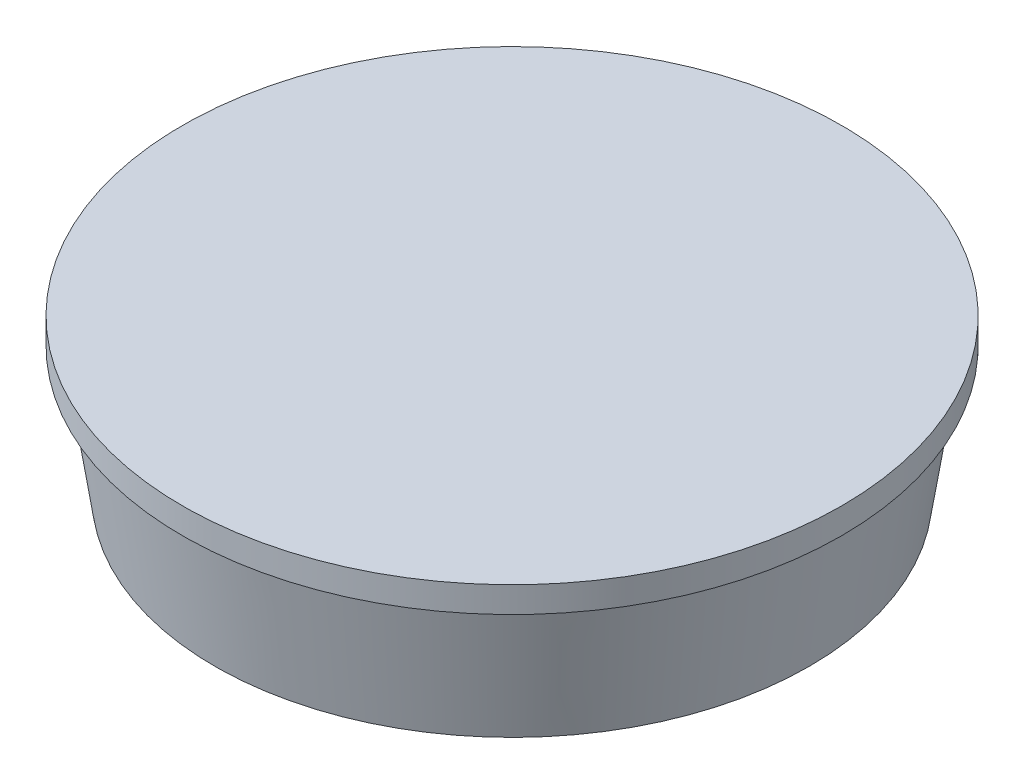
ISO-10303-21;
HEADER;
FILE_DESCRIPTION(('STEP AP214'),'2;1');
FILE_NAME('part.step','',(''),(''),'','','');
FILE_SCHEMA(('AUTOMOTIVE_DESIGN { 1 0 10303 214 1 1 1 1 }'));
ENDSEC;
DATA;
#1=APPLICATION_CONTEXT('core data for automotive mechanical design processes');
#2=APPLICATION_PROTOCOL_DEFINITION('international standard','automotive_design',2000,#1);
#3=PRODUCT_CONTEXT('',#1,'mechanical');
#4=PRODUCT('Part','Part','',(#3));
#5=PRODUCT_RELATED_PRODUCT_CATEGORY('part','',(#4));
#6=PRODUCT_DEFINITION_FORMATION('','',#4);
#7=PRODUCT_DEFINITION_CONTEXT('part definition',#1,'design');
#8=PRODUCT_DEFINITION('design','',#6,#7);
#9=PRODUCT_DEFINITION_SHAPE('','',#8);
#10=(LENGTH_UNIT() NAMED_UNIT(*) SI_UNIT(.MILLI.,.METRE.));
#11=(NAMED_UNIT(*) PLANE_ANGLE_UNIT() SI_UNIT($,.RADIAN.));
#12=(NAMED_UNIT(*) SI_UNIT($,.STERADIAN.) SOLID_ANGLE_UNIT());
#13=UNCERTAINTY_MEASURE_WITH_UNIT(LENGTH_MEASURE(1.E-05),#10,'distance_accuracy_value','');
#14=(GEOMETRIC_REPRESENTATION_CONTEXT(3) GLOBAL_UNCERTAINTY_ASSIGNED_CONTEXT((#13)) GLOBAL_UNIT_ASSIGNED_CONTEXT((#10,
#11,#12)) REPRESENTATION_CONTEXT('',''));
#15=CARTESIAN_POINT('',(0.,0.,0.));
#16=DIRECTION('',(0.,0.,1.));
#17=DIRECTION('',(1.,0.,0.));
#18=AXIS2_PLACEMENT_3D('',#15,#16,#17);
#19=CARTESIAN_POINT('',(0.,0.,0.));
#20=DIRECTION('',(0.,1.,0.));
#21=DIRECTION('',(-1.,0.,0.));
#22=AXIS2_PLACEMENT_3D('',#19,#20,#21);
#23=PLANE('',#22);
#24=CARTESIAN_POINT('',(0.,0.,0.));
#25=DIRECTION('',(0.,-1.,0.));
#26=DIRECTION('',(1.,0.,0.));
#27=AXIS2_PLACEMENT_3D('',#24,#25,#26);
#28=CIRCLE('',#27,25.5);
#29=CARTESIAN_POINT('',(25.5,0.,0.));
#30=VERTEX_POINT('',#29);
#31=EDGE_CURVE('E42',#30,#30,#28,.T.);
#32=ORIENTED_EDGE('',*,*,#31,.F.);
#33=EDGE_LOOP('',(#32));
#34=FACE_BOUND('',#33,.T.);
#35=ADVANCED_FACE('F31',(#34),#23,.T.);
#36=CARTESIAN_POINT('',(0.,-2.,0.));
#37=DIRECTION('',(0.,-1.,0.));
#38=DIRECTION('',(1.,0.,0.));
#39=AXIS2_PLACEMENT_3D('',#36,#37,#38);
#40=CYLINDRICAL_SURFACE('',#39,25.5);
#41=ORIENTED_EDGE('',*,*,#31,.T.);
#42=EDGE_LOOP('',(#41));
#43=FACE_BOUND('',#42,.T.);
#44=CARTESIAN_POINT('',(0.,-1.99999999999999,0.));
#45=DIRECTION('',(0.,-1.,0.));
#46=DIRECTION('',(1.,0.,0.));
#47=AXIS2_PLACEMENT_3D('',#44,#45,#46);
#48=CIRCLE('',#47,25.5);
#49=CARTESIAN_POINT('',(25.5,-2.,0.));
#50=VERTEX_POINT('',#49);
#51=EDGE_CURVE('E46',#50,#50,#48,.T.);
#52=ORIENTED_EDGE('',*,*,#51,.F.);
#53=EDGE_LOOP('',(#52));
#54=FACE_BOUND('',#53,.T.);
#55=ADVANCED_FACE('F78',(#43,#54),#40,.T.);
#56=CARTESIAN_POINT('',(25.5,-2.,0.));
#57=DIRECTION('',(0.,-1.,0.));
#58=DIRECTION('',(1.,0.,0.));
#59=AXIS2_PLACEMENT_3D('',#56,#57,#58);
#60=PLANE('',#59);
#61=ORIENTED_EDGE('',*,*,#51,.T.);
#62=EDGE_LOOP('',(#61));
#63=FACE_BOUND('',#62,.T.);
#64=CARTESIAN_POINT('',(0.,-1.99999999999999,0.));
#65=DIRECTION('',(0.,-1.,0.));
#66=DIRECTION('',(1.,0.,0.));
#67=AXIS2_PLACEMENT_3D('',#64,#65,#66);
#68=CIRCLE('',#67,24.5);
#69=CARTESIAN_POINT('',(24.5,-1.99999999999999,0.));
#70=VERTEX_POINT('',#69);
#71=EDGE_CURVE('E51',#70,#70,#68,.T.);
#72=ORIENTED_EDGE('',*,*,#71,.F.);
#73=EDGE_LOOP('',(#72));
#74=FACE_BOUND('',#73,.T.);
#75=ADVANCED_FACE('F74',(#63,#74),#60,.T.);
#76=CARTESIAN_POINT('',(0.,-12.,0.));
#77=DIRECTION('',(0.,1.,0.));
#78=DIRECTION('',(-1.,0.,0.));
#79=AXIS2_PLACEMENT_3D('',#76,#77,#78);
#80=CONICAL_SURFACE('',#79,23.,0.148889947609497);
#81=ORIENTED_EDGE('',*,*,#71,.T.);
#82=EDGE_LOOP('',(#81));
#83=FACE_BOUND('',#82,.T.);
#84=CARTESIAN_POINT('',(0.,-12.,0.));
#85=DIRECTION('',(0.,-1.,0.));
#86=DIRECTION('',(1.,0.,0.));
#87=AXIS2_PLACEMENT_3D('',#84,#85,#86);
#88=CIRCLE('',#87,23.);
#89=CARTESIAN_POINT('',(23.,-12.,0.));
#90=VERTEX_POINT('',#89);
#91=EDGE_CURVE('E54',#90,#90,#88,.T.);
#92=ORIENTED_EDGE('',*,*,#91,.F.);
#93=EDGE_LOOP('',(#92));
#94=FACE_BOUND('',#93,.T.);
#95=ADVANCED_FACE('F65',(#83,#94),#80,.T.);
#96=CARTESIAN_POINT('',(23.,-12.,0.));
#97=DIRECTION('',(0.,-1.,0.));
#98=DIRECTION('',(1.,0.,0.));
#99=AXIS2_PLACEMENT_3D('',#96,#97,#98);
#100=PLANE('',#99);
#101=ORIENTED_EDGE('',*,*,#91,.T.);
#102=EDGE_LOOP('',(#101));
#103=FACE_BOUND('',#102,.T.);
#104=CARTESIAN_POINT('',(0.,-12.,0.));
#105=DIRECTION('',(0.,-1.,0.));
#106=DIRECTION('',(1.,0.,0.));
#107=AXIS2_PLACEMENT_3D('',#104,#105,#106);
#108=CIRCLE('',#107,22.);
#109=CARTESIAN_POINT('',(22.,-12.,0.));
#110=VERTEX_POINT('',#109);
#111=EDGE_CURVE('E57',#110,#110,#108,.T.);
#112=ORIENTED_EDGE('',*,*,#111,.F.);
#113=EDGE_LOOP('',(#112));
#114=FACE_BOUND('',#113,.T.);
#115=ADVANCED_FACE('F63',(#103,#114),#100,.T.);
#116=CARTESIAN_POINT('',(0.,-2.,0.));
#117=DIRECTION('',(0.,-1.,0.));
#118=DIRECTION('',(1.,0.,0.));
#119=AXIS2_PLACEMENT_3D('',#116,#117,#118);
#120=CYLINDRICAL_SURFACE('',#119,22.);
#121=CARTESIAN_POINT('',(0.,-6.,0.));
#122=DIRECTION('',(0.,-1.,0.));
#123=DIRECTION('',(1.,0.,0.));
#124=AXIS2_PLACEMENT_3D('',#121,#122,#123);
#125=CIRCLE('',#124,22.);
#126=CARTESIAN_POINT('',(22.,-6.,0.));
#127=VERTEX_POINT('',#126);
#128=EDGE_CURVE('E10',#127,#127,#125,.F.);
#129=ORIENTED_EDGE('',*,*,#128,.T.);
#130=EDGE_LOOP('',(#129));
#131=FACE_BOUND('',#130,.T.);
#132=ORIENTED_EDGE('',*,*,#111,.T.);
#133=EDGE_LOOP('',(#132));
#134=FACE_BOUND('',#133,.T.);
#135=ADVANCED_FACE('F61',(#131,#134),#120,.F.);
#136=CARTESIAN_POINT('',(0.,-2.,0.));
#137=DIRECTION('',(0.,-1.,0.));
#138=DIRECTION('',(1.,0.,0.));
#139=AXIS2_PLACEMENT_3D('',#136,#137,#138);
#140=PLANE('',#139);
#141=CARTESIAN_POINT('',(0.,-2.,0.));
#142=DIRECTION('',(0.,-1.,0.));
#143=DIRECTION('',(1.,0.,0.));
#144=AXIS2_PLACEMENT_3D('',#141,#142,#143);
#145=CIRCLE('',#144,18.);
#146=CARTESIAN_POINT('',(18.,-2.,0.));
#147=VERTEX_POINT('',#146);
#148=EDGE_CURVE('E38',#147,#147,#145,.T.);
#149=ORIENTED_EDGE('',*,*,#148,.T.);
#150=EDGE_LOOP('',(#149));
#151=FACE_BOUND('',#150,.T.);
#152=ADVANCED_FACE('F72',(#151),#140,.T.);
#153=CARTESIAN_POINT('',(0.,-6.,0.));
#154=DIRECTION('',(0.,-1.,0.));
#155=DIRECTION('',(1.,0.,0.));
#156=AXIS2_PLACEMENT_3D('',#153,#154,#155);
#157=TOROIDAL_SURFACE('',#156,18.,4.);
#158=ORIENTED_EDGE('',*,*,#128,.F.);
#159=EDGE_LOOP('',(#158));
#160=FACE_BOUND('',#159,.T.);
#161=ORIENTED_EDGE('',*,*,#148,.F.);
#162=EDGE_LOOP('',(#161));
#163=FACE_BOUND('',#162,.T.);
#164=ADVANCED_FACE('F33',(#160,#163),#157,.F.);
#165=CLOSED_SHELL('',(#35,#55,#75,#95,#115,#135,#152,#164));
#166=MANIFOLD_SOLID_BREP('B2',#165);
#167=ADVANCED_BREP_SHAPE_REPRESENTATION('',(#18,#166),#14);
#168=SHAPE_DEFINITION_REPRESENTATION(#9,#167);
ENDSEC;
END-ISO-10303-21;
